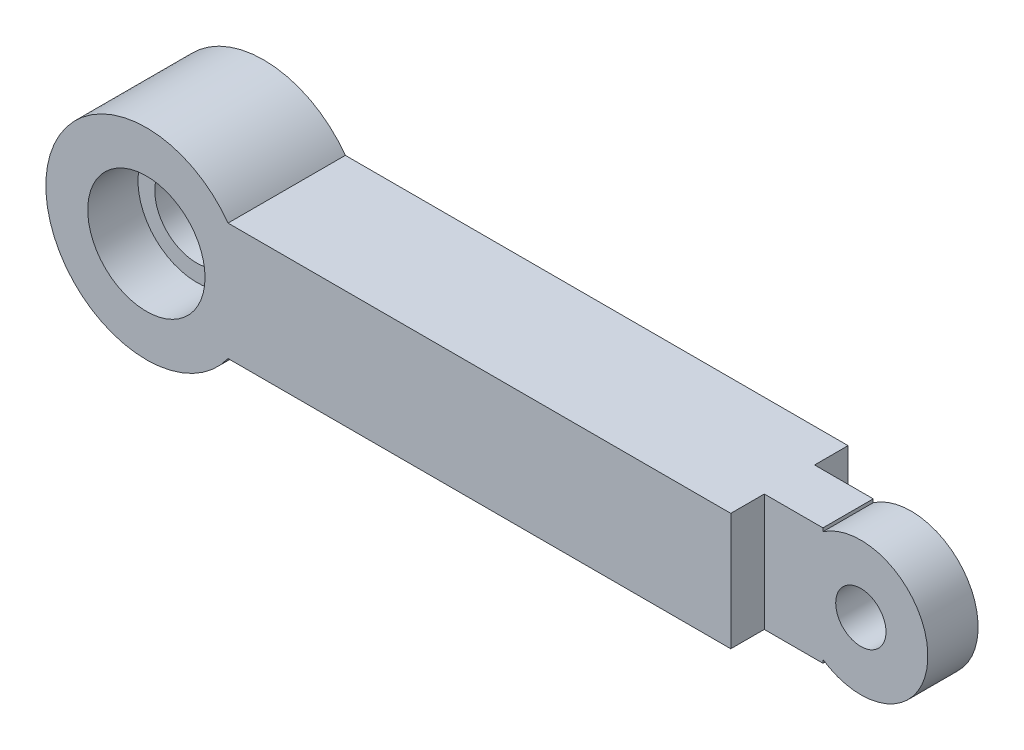
ISO-10303-21;
HEADER;
FILE_DESCRIPTION(('STEP AP214'),'2;1');
FILE_NAME('part.step','',(''),(''),'','','');
FILE_SCHEMA(('AUTOMOTIVE_DESIGN { 1 0 10303 214 1 1 1 1 }'));
ENDSEC;
DATA;
#1=APPLICATION_CONTEXT('core data for automotive mechanical design processes');
#2=APPLICATION_PROTOCOL_DEFINITION('international standard','automotive_design',2000,#1);
#3=PRODUCT_CONTEXT('',#1,'mechanical');
#4=PRODUCT('Part','Part','',(#3));
#5=PRODUCT_RELATED_PRODUCT_CATEGORY('part','',(#4));
#6=PRODUCT_DEFINITION_FORMATION('','',#4);
#7=PRODUCT_DEFINITION_CONTEXT('part definition',#1,'design');
#8=PRODUCT_DEFINITION('design','',#6,#7);
#9=PRODUCT_DEFINITION_SHAPE('','',#8);
#10=(LENGTH_UNIT() NAMED_UNIT(*) SI_UNIT(.MILLI.,.METRE.));
#11=(NAMED_UNIT(*) PLANE_ANGLE_UNIT() SI_UNIT($,.RADIAN.));
#12=(NAMED_UNIT(*) SI_UNIT($,.STERADIAN.) SOLID_ANGLE_UNIT());
#13=UNCERTAINTY_MEASURE_WITH_UNIT(LENGTH_MEASURE(1.E-05),#10,'distance_accuracy_value','');
#14=(GEOMETRIC_REPRESENTATION_CONTEXT(3) GLOBAL_UNCERTAINTY_ASSIGNED_CONTEXT((#13)) GLOBAL_UNIT_ASSIGNED_CONTEXT((#10,
#11,#12)) REPRESENTATION_CONTEXT('',''));
#15=CARTESIAN_POINT('',(0.,0.,0.));
#16=DIRECTION('',(0.,0.,1.));
#17=DIRECTION('',(1.,0.,0.));
#18=AXIS2_PLACEMENT_3D('',#15,#16,#17);
#19=CARTESIAN_POINT('',(-198.733971724045,0.,20.));
#20=DIRECTION('',(0.,0.,1.));
#21=DIRECTION('',(1.,0.,0.));
#22=AXIS2_PLACEMENT_3D('',#19,#20,#21);
#23=CYLINDRICAL_SURFACE('',#22,25.);
#24=CARTESIAN_POINT('',(-198.733971724045,0.,20.));
#25=DIRECTION('',(0.,0.,1.));
#26=DIRECTION('',(1.,0.,0.));
#27=AXIS2_PLACEMENT_3D('',#24,#25,#26);
#28=CIRCLE('',#27,25.);
#29=CARTESIAN_POINT('',(-173.733971724045,0.,20.));
#30=VERTEX_POINT('',#29);
#31=EDGE_CURVE('E198',#30,#30,#28,.T.);
#32=ORIENTED_EDGE('',*,*,#31,.F.);
#33=EDGE_LOOP('',(#32));
#34=FACE_BOUND('',#33,.T.);
#35=CARTESIAN_POINT('',(-198.733971724045,0.,40.));
#36=DIRECTION('',(0.,0.,1.));
#37=DIRECTION('',(1.,0.,0.));
#38=AXIS2_PLACEMENT_3D('',#35,#36,#37);
#39=CIRCLE('',#38,25.);
#40=CARTESIAN_POINT('',(-173.733971724045,0.,40.));
#41=VERTEX_POINT('',#40);
#42=EDGE_CURVE('E43',#41,#41,#39,.F.);
#43=ORIENTED_EDGE('',*,*,#42,.F.);
#44=EDGE_LOOP('',(#43));
#45=FACE_BOUND('',#44,.T.);
#46=ADVANCED_FACE('F39',(#34,#45),#23,.F.);
#47=CARTESIAN_POINT('',(-207.358971724045,14.9389382152816,70.));
#48=DIRECTION('',(0.,0.,-1.));
#49=DIRECTION('',(-1.,0.,0.));
#50=AXIS2_PLACEMENT_3D('',#47,#48,#49);
#51=CYLINDRICAL_SURFACE('',#50,2.);
#52=CARTESIAN_POINT('',(-207.358971724045,14.9389382152816,0.));
#53=DIRECTION('',(0.,0.,-1.));
#54=DIRECTION('',(-1.,0.,0.));
#55=AXIS2_PLACEMENT_3D('',#52,#53,#54);
#56=CIRCLE('',#55,2.);
#57=CARTESIAN_POINT('',(-209.358971724045,14.9389382152816,0.));
#58=VERTEX_POINT('',#57);
#59=EDGE_CURVE('E229',#58,#58,#56,.T.);
#60=ORIENTED_EDGE('',*,*,#59,.T.);
#61=EDGE_LOOP('',(#60));
#62=FACE_BOUND('',#61,.T.);
#63=CARTESIAN_POINT('',(-207.358971724045,14.9389382152816,20.));
#64=DIRECTION('',(0.,0.,1.));
#65=DIRECTION('',(1.,0.,0.));
#66=AXIS2_PLACEMENT_3D('',#63,#64,#65);
#67=CIRCLE('',#66,2.);
#68=CARTESIAN_POINT('',(-205.358971724045,14.9389382152816,20.));
#69=VERTEX_POINT('',#68);
#70=EDGE_CURVE('E222',#69,#69,#67,.F.);
#71=ORIENTED_EDGE('',*,*,#70,.F.);
#72=EDGE_LOOP('',(#71));
#73=FACE_BOUND('',#72,.T.);
#74=ADVANCED_FACE('F286',(#62,#73),#51,.F.);
#75=CARTESIAN_POINT('',(-190.108971724045,14.9389382152816,70.));
#76=DIRECTION('',(0.,0.,-1.));
#77=DIRECTION('',(-1.,0.,0.));
#78=AXIS2_PLACEMENT_3D('',#75,#76,#77);
#79=CYLINDRICAL_SURFACE('',#78,1.99999999999988);
#80=CARTESIAN_POINT('',(-190.108971724045,14.9389382152816,0.));
#81=DIRECTION('',(0.,0.,-1.));
#82=DIRECTION('',(-1.,0.,0.));
#83=AXIS2_PLACEMENT_3D('',#80,#81,#82);
#84=CIRCLE('',#83,1.99999999999988);
#85=CARTESIAN_POINT('',(-192.108971724045,14.9389382152816,0.));
#86=VERTEX_POINT('',#85);
#87=EDGE_CURVE('E226',#86,#86,#84,.T.);
#88=ORIENTED_EDGE('',*,*,#87,.T.);
#89=EDGE_LOOP('',(#88));
#90=FACE_BOUND('',#89,.T.);
#91=CARTESIAN_POINT('',(-190.108971724045,14.9389382152816,20.));
#92=DIRECTION('',(0.,0.,1.));
#93=DIRECTION('',(1.,0.,0.));
#94=AXIS2_PLACEMENT_3D('',#91,#92,#93);
#95=CIRCLE('',#94,1.99999999999988);
#96=CARTESIAN_POINT('',(-188.108971724045,14.9389382152816,20.));
#97=VERTEX_POINT('',#96);
#98=EDGE_CURVE('E219',#97,#97,#95,.F.);
#99=ORIENTED_EDGE('',*,*,#98,.F.);
#100=EDGE_LOOP('',(#99));
#101=FACE_BOUND('',#100,.T.);
#102=ADVANCED_FACE('F294',(#90,#101),#79,.F.);
#103=CARTESIAN_POINT('',(-181.483971724045,0.,70.));
#104=DIRECTION('',(0.,0.,-1.));
#105=DIRECTION('',(-1.,0.,0.));
#106=AXIS2_PLACEMENT_3D('',#103,#104,#105);
#107=CYLINDRICAL_SURFACE('',#106,2.);
#108=CARTESIAN_POINT('',(-181.483971724045,0.,0.));
#109=DIRECTION('',(0.,0.,-1.));
#110=DIRECTION('',(-1.,0.,0.));
#111=AXIS2_PLACEMENT_3D('',#108,#109,#110);
#112=CIRCLE('',#111,2.);
#113=CARTESIAN_POINT('',(-183.483971724045,0.,0.));
#114=VERTEX_POINT('',#113);
#115=EDGE_CURVE('E230',#114,#114,#112,.T.);
#116=ORIENTED_EDGE('',*,*,#115,.T.);
#117=EDGE_LOOP('',(#116));
#118=FACE_BOUND('',#117,.T.);
#119=CARTESIAN_POINT('',(-181.483971724045,0.,20.));
#120=DIRECTION('',(0.,0.,1.));
#121=DIRECTION('',(1.,0.,0.));
#122=AXIS2_PLACEMENT_3D('',#119,#120,#121);
#123=CIRCLE('',#122,2.);
#124=CARTESIAN_POINT('',(-179.483971724045,0.,20.));
#125=VERTEX_POINT('',#124);
#126=EDGE_CURVE('E216',#125,#125,#123,.F.);
#127=ORIENTED_EDGE('',*,*,#126,.F.);
#128=EDGE_LOOP('',(#127));
#129=FACE_BOUND('',#128,.T.);
#130=ADVANCED_FACE('F304',(#118,#129),#107,.F.);
#131=CARTESIAN_POINT('',(-190.108971724045,-14.9389382152816,70.));
#132=DIRECTION('',(0.,0.,-1.));
#133=DIRECTION('',(-1.,0.,0.));
#134=AXIS2_PLACEMENT_3D('',#131,#132,#133);
#135=CYLINDRICAL_SURFACE('',#134,2.);
#136=CARTESIAN_POINT('',(-190.108971724045,-14.9389382152816,0.));
#137=DIRECTION('',(0.,0.,-1.));
#138=DIRECTION('',(-1.,0.,0.));
#139=AXIS2_PLACEMENT_3D('',#136,#137,#138);
#140=CIRCLE('',#139,2.);
#141=CARTESIAN_POINT('',(-192.108971724045,-14.9389382152816,0.));
#142=VERTEX_POINT('',#141);
#143=EDGE_CURVE('E233',#142,#142,#140,.T.);
#144=ORIENTED_EDGE('',*,*,#143,.T.);
#145=EDGE_LOOP('',(#144));
#146=FACE_BOUND('',#145,.T.);
#147=CARTESIAN_POINT('',(-190.108971724045,-14.9389382152816,20.));
#148=DIRECTION('',(0.,0.,1.));
#149=DIRECTION('',(1.,0.,0.));
#150=AXIS2_PLACEMENT_3D('',#147,#148,#149);
#151=CIRCLE('',#150,2.);
#152=CARTESIAN_POINT('',(-188.108971724045,-14.9389382152816,20.));
#153=VERTEX_POINT('',#152);
#154=EDGE_CURVE('E202',#153,#153,#151,.F.);
#155=ORIENTED_EDGE('',*,*,#154,.F.);
#156=EDGE_LOOP('',(#155));
#157=FACE_BOUND('',#156,.T.);
#158=ADVANCED_FACE('F308',(#146,#157),#135,.F.);
#159=CARTESIAN_POINT('',(-207.358971724045,-14.9389382152816,70.));
#160=DIRECTION('',(0.,0.,-1.));
#161=DIRECTION('',(-1.,0.,0.));
#162=AXIS2_PLACEMENT_3D('',#159,#160,#161);
#163=CYLINDRICAL_SURFACE('',#162,2.);
#164=CARTESIAN_POINT('',(-207.358971724045,-14.9389382152816,0.));
#165=DIRECTION('',(0.,0.,-1.));
#166=DIRECTION('',(-1.,0.,0.));
#167=AXIS2_PLACEMENT_3D('',#164,#165,#166);
#168=CIRCLE('',#167,2.);
#169=CARTESIAN_POINT('',(-209.358971724045,-14.9389382152816,0.));
#170=VERTEX_POINT('',#169);
#171=EDGE_CURVE('E236',#170,#170,#168,.T.);
#172=ORIENTED_EDGE('',*,*,#171,.T.);
#173=EDGE_LOOP('',(#172));
#174=FACE_BOUND('',#173,.T.);
#175=CARTESIAN_POINT('',(-207.358971724045,-14.9389382152816,20.));
#176=DIRECTION('',(0.,0.,1.));
#177=DIRECTION('',(1.,0.,0.));
#178=AXIS2_PLACEMENT_3D('',#175,#176,#177);
#179=CIRCLE('',#178,2.);
#180=CARTESIAN_POINT('',(-205.358971724045,-14.9389382152816,20.));
#181=VERTEX_POINT('',#180);
#182=EDGE_CURVE('E197',#181,#181,#179,.F.);
#183=ORIENTED_EDGE('',*,*,#182,.F.);
#184=EDGE_LOOP('',(#183));
#185=FACE_BOUND('',#184,.T.);
#186=ADVANCED_FACE('F279',(#174,#185),#163,.F.);
#187=CARTESIAN_POINT('',(-215.983971724045,0.,70.));
#188=DIRECTION('',(0.,0.,-1.));
#189=DIRECTION('',(-1.,0.,0.));
#190=AXIS2_PLACEMENT_3D('',#187,#188,#189);
#191=CYLINDRICAL_SURFACE('',#190,2.);
#192=CARTESIAN_POINT('',(-215.983971724045,0.,0.));
#193=DIRECTION('',(0.,0.,-1.));
#194=DIRECTION('',(-1.,0.,0.));
#195=AXIS2_PLACEMENT_3D('',#192,#193,#194);
#196=CIRCLE('',#195,2.);
#197=CARTESIAN_POINT('',(-217.983971724045,0.,0.));
#198=VERTEX_POINT('',#197);
#199=EDGE_CURVE('E225',#198,#198,#196,.T.);
#200=ORIENTED_EDGE('',*,*,#199,.T.);
#201=EDGE_LOOP('',(#200));
#202=FACE_BOUND('',#201,.T.);
#203=CARTESIAN_POINT('',(-215.983971724045,0.,20.));
#204=DIRECTION('',(0.,0.,1.));
#205=DIRECTION('',(1.,0.,0.));
#206=AXIS2_PLACEMENT_3D('',#203,#204,#205);
#207=CIRCLE('',#206,2.);
#208=CARTESIAN_POINT('',(-213.983971724045,0.,20.));
#209=VERTEX_POINT('',#208);
#210=EDGE_CURVE('E195',#209,#209,#207,.F.);
#211=ORIENTED_EDGE('',*,*,#210,.F.);
#212=EDGE_LOOP('',(#211));
#213=FACE_BOUND('',#212,.T.);
#214=ADVANCED_FACE('F271',(#202,#213),#191,.F.);
#215=CARTESIAN_POINT('',(185.,-81.0977222864645,20.));
#216=DIRECTION('',(1.,0.,0.));
#217=DIRECTION('',(0.,0.,-1.));
#218=AXIS2_PLACEMENT_3D('',#215,#216,#217);
#219=PLANE('',#218);
#220=DIRECTION('',(0.,0.,1.));
#221=VECTOR('',#220,1.);
#222=CARTESIAN_POINT('',(185.,32.9999999999999,-93.1370849898475));
#223=LINE('',#222,#221);
#224=CARTESIAN_POINT('',(185.,33.,20.));
#225=VERTEX_POINT('',#224);
#226=CARTESIAN_POINT('',(185.,33.,50.));
#227=VERTEX_POINT('',#226);
#228=EDGE_CURVE('E134',#225,#227,#223,.T.);
#229=ORIENTED_EDGE('',*,*,#228,.F.);
#230=DIRECTION('',(0.,1.,0.));
#231=VECTOR('',#230,1.);
#232=CARTESIAN_POINT('',(185.,-81.0977222864645,20.));
#233=LINE('',#232,#231);
#234=CARTESIAN_POINT('',(185.,35.,20.));
#235=VERTEX_POINT('',#234);
#236=EDGE_CURVE('E125',#225,#235,#233,.T.);
#237=ORIENTED_EDGE('',*,*,#236,.T.);
#238=DIRECTION('',(0.,0.,-1.));
#239=VECTOR('',#238,1.);
#240=CARTESIAN_POINT('',(185.,35.,20.));
#241=LINE('',#240,#239);
#242=CARTESIAN_POINT('',(185.,35.,50.));
#243=VERTEX_POINT('',#242);
#244=EDGE_CURVE('E145',#243,#235,#241,.T.);
#245=ORIENTED_EDGE('',*,*,#244,.F.);
#246=DIRECTION('',(0.,1.,0.));
#247=VECTOR('',#246,1.);
#248=CARTESIAN_POINT('',(185.,-81.0977222864645,50.));
#249=LINE('',#248,#247);
#250=EDGE_CURVE('E56',#227,#243,#249,.T.);
#251=ORIENTED_EDGE('',*,*,#250,.F.);
#252=EDGE_LOOP('',(#229,#237,#245,#251));
#253=FACE_BOUND('',#252,.T.);
#254=ADVANCED_FACE('F268',(#253),#219,.T.);
#255=CARTESIAN_POINT('',(150.,35.,70.));
#256=DIRECTION('',(-1.,0.,0.));
#257=DIRECTION('',(0.,0.,1.));
#258=AXIS2_PLACEMENT_3D('',#255,#256,#257);
#259=PLANE('',#258);
#260=DIRECTION('',(0.,1.,0.));
#261=VECTOR('',#260,1.);
#262=CARTESIAN_POINT('',(150.,-81.0977222864645,20.));
#263=LINE('',#262,#261);
#264=CARTESIAN_POINT('',(150.,-35.,20.));
#265=VERTEX_POINT('',#264);
#266=CARTESIAN_POINT('',(150.,35.,20.));
#267=VERTEX_POINT('',#266);
#268=EDGE_CURVE('E124',#265,#267,#263,.T.);
#269=ORIENTED_EDGE('',*,*,#268,.F.);
#270=DIRECTION('',(0.,0.,-1.));
#271=VECTOR('',#270,1.);
#272=CARTESIAN_POINT('',(150.,-35.,70.));
#273=LINE('',#272,#271);
#274=CARTESIAN_POINT('',(150.,-35.,0.));
#275=VERTEX_POINT('',#274);
#276=EDGE_CURVE('E181',#265,#275,#273,.T.);
#277=ORIENTED_EDGE('',*,*,#276,.T.);
#278=DIRECTION('',(0.,1.,0.));
#279=VECTOR('',#278,1.);
#280=CARTESIAN_POINT('',(150.,35.,0.));
#281=LINE('',#280,#279);
#282=CARTESIAN_POINT('',(150.,35.,0.));
#283=VERTEX_POINT('',#282);
#284=EDGE_CURVE('E169',#275,#283,#281,.T.);
#285=ORIENTED_EDGE('',*,*,#284,.T.);
#286=DIRECTION('',(0.,0.,-1.));
#287=VECTOR('',#286,1.);
#288=CARTESIAN_POINT('',(150.,35.,70.));
#289=LINE('',#288,#287);
#290=EDGE_CURVE('E48',#267,#283,#289,.T.);
#291=ORIENTED_EDGE('',*,*,#290,.F.);
#292=EDGE_LOOP('',(#269,#277,#285,#291));
#293=FACE_BOUND('',#292,.T.);
#294=ADVANCED_FACE('F270',(#293),#259,.F.);
#295=CARTESIAN_POINT('',(150.,-35.,70.));
#296=VERTEX_POINT('',#295);
#297=CARTESIAN_POINT('',(150.,-35.,50.));
#298=VERTEX_POINT('',#297);
#299=EDGE_CURVE('E189',#296,#298,#273,.T.);
#300=ORIENTED_EDGE('',*,*,#299,.T.);
#301=DIRECTION('',(0.,1.,0.));
#302=VECTOR('',#301,1.);
#303=CARTESIAN_POINT('',(150.,-81.0977222864645,50.));
#304=LINE('',#303,#302);
#305=CARTESIAN_POINT('',(150.,35.,50.));
#306=VERTEX_POINT('',#305);
#307=EDGE_CURVE('E161',#298,#306,#304,.T.);
#308=ORIENTED_EDGE('',*,*,#307,.T.);
#309=CARTESIAN_POINT('',(150.,35.,70.));
#310=VERTEX_POINT('',#309);
#311=EDGE_CURVE('E11',#310,#306,#289,.T.);
#312=ORIENTED_EDGE('',*,*,#311,.F.);
#313=DIRECTION('',(0.,1.,0.));
#314=VECTOR('',#313,1.);
#315=CARTESIAN_POINT('',(150.,35.,70.));
#316=LINE('',#315,#314);
#317=EDGE_CURVE('E172',#296,#310,#316,.T.);
#318=ORIENTED_EDGE('',*,*,#317,.F.);
#319=EDGE_LOOP('',(#300,#308,#312,#318));
#320=FACE_BOUND('',#319,.T.);
#321=ADVANCED_FACE('F41',(#320),#259,.F.);
#322=CARTESIAN_POINT('',(-150.,35.,70.));
#323=DIRECTION('',(0.,-1.,0.));
#324=DIRECTION('',(0.,0.,-1.));
#325=AXIS2_PLACEMENT_3D('',#322,#323,#324);
#326=PLANE('',#325);
#327=DIRECTION('',(-1.,0.,0.));
#328=VECTOR('',#327,1.);
#329=CARTESIAN_POINT('',(-150.,35.,0.));
#330=LINE('',#329,#328);
#331=CARTESIAN_POINT('',(-150.,35.,0.));
#332=VERTEX_POINT('',#331);
#333=EDGE_CURVE('E184',#283,#332,#330,.T.);
#334=ORIENTED_EDGE('',*,*,#333,.T.);
#335=DIRECTION('',(0.,0.,-1.));
#336=VECTOR('',#335,1.);
#337=CARTESIAN_POINT('',(-150.,35.,70.));
#338=LINE('',#337,#336);
#339=CARTESIAN_POINT('',(-150.,35.,70.));
#340=VERTEX_POINT('',#339);
#341=EDGE_CURVE('E194',#340,#332,#338,.T.);
#342=ORIENTED_EDGE('',*,*,#341,.F.);
#343=DIRECTION('',(-1.,0.,0.));
#344=VECTOR('',#343,1.);
#345=CARTESIAN_POINT('',(-150.,35.,70.));
#346=LINE('',#345,#344);
#347=EDGE_CURVE('E175',#310,#340,#346,.T.);
#348=ORIENTED_EDGE('',*,*,#347,.F.);
#349=ORIENTED_EDGE('',*,*,#311,.T.);
#350=DIRECTION('',(1.,0.,0.));
#351=VECTOR('',#350,1.);
#352=CARTESIAN_POINT('',(185.,35.,50.));
#353=LINE('',#352,#351);
#354=EDGE_CURVE('E157',#306,#243,#353,.T.);
#355=ORIENTED_EDGE('',*,*,#354,.T.);
#356=ORIENTED_EDGE('',*,*,#244,.T.);
#357=DIRECTION('',(-1.,0.,0.));
#358=VECTOR('',#357,1.);
#359=CARTESIAN_POINT('',(185.,35.,20.));
#360=LINE('',#359,#358);
#361=EDGE_CURVE('E154',#235,#267,#360,.T.);
#362=ORIENTED_EDGE('',*,*,#361,.T.);
#363=ORIENTED_EDGE('',*,*,#290,.T.);
#364=EDGE_LOOP('',(#334,#342,#348,#349,#355,#356,#362,#363));
#365=FACE_BOUND('',#364,.T.);
#366=ADVANCED_FACE('F266',(#365),#326,.F.);
#367=CARTESIAN_POINT('',(-150.,-35.,70.));
#368=DIRECTION('',(0.,1.,0.));
#369=DIRECTION('',(0.,0.,1.));
#370=AXIS2_PLACEMENT_3D('',#367,#368,#369);
#371=PLANE('',#370);
#372=DIRECTION('',(1.,0.,0.));
#373=VECTOR('',#372,1.);
#374=CARTESIAN_POINT('',(-150.,-35.,0.));
#375=LINE('',#374,#373);
#376=CARTESIAN_POINT('',(-150.,-35.,0.));
#377=VERTEX_POINT('',#376);
#378=EDGE_CURVE('E176',#377,#275,#375,.T.);
#379=ORIENTED_EDGE('',*,*,#378,.T.);
#380=ORIENTED_EDGE('',*,*,#276,.F.);
#381=DIRECTION('',(1.,0.,0.));
#382=VECTOR('',#381,1.);
#383=CARTESIAN_POINT('',(185.,-35.,20.));
#384=LINE('',#383,#382);
#385=CARTESIAN_POINT('',(185.,-35.,20.));
#386=VERTEX_POINT('',#385);
#387=EDGE_CURVE('E151',#265,#386,#384,.T.);
#388=ORIENTED_EDGE('',*,*,#387,.T.);
#389=DIRECTION('',(0.,0.,1.));
#390=VECTOR('',#389,1.);
#391=CARTESIAN_POINT('',(185.,-35.,20.));
#392=LINE('',#391,#390);
#393=CARTESIAN_POINT('',(185.,-35.,50.));
#394=VERTEX_POINT('',#393);
#395=EDGE_CURVE('E120',#386,#394,#392,.T.);
#396=ORIENTED_EDGE('',*,*,#395,.T.);
#397=DIRECTION('',(-1.,0.,0.));
#398=VECTOR('',#397,1.);
#399=CARTESIAN_POINT('',(185.,-35.,50.));
#400=LINE('',#399,#398);
#401=EDGE_CURVE('E146',#394,#298,#400,.T.);
#402=ORIENTED_EDGE('',*,*,#401,.T.);
#403=ORIENTED_EDGE('',*,*,#299,.F.);
#404=DIRECTION('',(1.,0.,0.));
#405=VECTOR('',#404,1.);
#406=CARTESIAN_POINT('',(-150.,-35.,70.));
#407=LINE('',#406,#405);
#408=CARTESIAN_POINT('',(-150.,-35.,70.));
#409=VERTEX_POINT('',#408);
#410=EDGE_CURVE('E179',#409,#296,#407,.T.);
#411=ORIENTED_EDGE('',*,*,#410,.F.);
#412=DIRECTION('',(0.,0.,-1.));
#413=VECTOR('',#412,1.);
#414=CARTESIAN_POINT('',(-150.,-35.,70.));
#415=LINE('',#414,#413);
#416=EDGE_CURVE('E191',#409,#377,#415,.T.);
#417=ORIENTED_EDGE('',*,*,#416,.T.);
#418=EDGE_LOOP('',(#379,#380,#388,#396,#402,#403,#411,#417));
#419=FACE_BOUND('',#418,.T.);
#420=ADVANCED_FACE('F260',(#419),#371,.F.);
#421=CARTESIAN_POINT('',(0.,0.,70.));
#422=DIRECTION('',(0.,0.,1.));
#423=DIRECTION('',(1.,0.,0.));
#424=AXIS2_PLACEMENT_3D('',#421,#422,#423);
#425=PLANE('',#424);
#426=CARTESIAN_POINT('',(-198.733971724045,0.,70.));
#427=DIRECTION('',(0.,0.,1.));
#428=DIRECTION('',(1.,0.,0.));
#429=AXIS2_PLACEMENT_3D('',#426,#427,#428);
#430=CIRCLE('',#429,35.0000000000001);
#431=CARTESIAN_POINT('',(-163.733971724045,0.,70.));
#432=VERTEX_POINT('',#431);
#433=EDGE_CURVE('E211',#432,#432,#430,.T.);
#434=ORIENTED_EDGE('',*,*,#433,.F.);
#435=EDGE_LOOP('',(#434));
#436=FACE_BOUND('',#435,.T.);
#437=ORIENTED_EDGE('',*,*,#347,.T.);
#438=CARTESIAN_POINT('',(-198.733971724045,0.,70.));
#439=DIRECTION('',(0.,0.,-1.));
#440=DIRECTION('',(-1.,0.,0.));
#441=AXIS2_PLACEMENT_3D('',#438,#439,#440);
#442=CIRCLE('',#441,60.);
#443=EDGE_CURVE('E167',#409,#340,#442,.T.);
#444=ORIENTED_EDGE('',*,*,#443,.F.);
#445=ORIENTED_EDGE('',*,*,#410,.T.);
#446=ORIENTED_EDGE('',*,*,#317,.T.);
#447=EDGE_LOOP('',(#437,#444,#445,#446));
#448=FACE_BOUND('',#447,.T.);
#449=ADVANCED_FACE('F340',(#436,#448),#425,.T.);
#450=CARTESIAN_POINT('',(0.,0.,0.));
#451=DIRECTION('',(0.,0.,1.));
#452=DIRECTION('',(1.,0.,0.));
#453=AXIS2_PLACEMENT_3D('',#450,#451,#452);
#454=PLANE('',#453);
#455=ORIENTED_EDGE('',*,*,#199,.F.);
#456=EDGE_LOOP('',(#455));
#457=FACE_BOUND('',#456,.T.);
#458=ORIENTED_EDGE('',*,*,#171,.F.);
#459=EDGE_LOOP('',(#458));
#460=FACE_BOUND('',#459,.T.);
#461=ORIENTED_EDGE('',*,*,#143,.F.);
#462=EDGE_LOOP('',(#461));
#463=FACE_BOUND('',#462,.T.);
#464=ORIENTED_EDGE('',*,*,#115,.F.);
#465=EDGE_LOOP('',(#464));
#466=FACE_BOUND('',#465,.T.);
#467=ORIENTED_EDGE('',*,*,#87,.F.);
#468=EDGE_LOOP('',(#467));
#469=FACE_BOUND('',#468,.T.);
#470=ORIENTED_EDGE('',*,*,#59,.F.);
#471=EDGE_LOOP('',(#470));
#472=FACE_BOUND('',#471,.T.);
#473=ORIENTED_EDGE('',*,*,#378,.F.);
#474=CARTESIAN_POINT('',(-198.733971724045,0.,0.));
#475=DIRECTION('',(0.,0.,-1.));
#476=DIRECTION('',(-1.,0.,0.));
#477=AXIS2_PLACEMENT_3D('',#474,#475,#476);
#478=CIRCLE('',#477,60.);
#479=EDGE_CURVE('E166',#377,#332,#478,.T.);
#480=ORIENTED_EDGE('',*,*,#479,.T.);
#481=ORIENTED_EDGE('',*,*,#333,.F.);
#482=ORIENTED_EDGE('',*,*,#284,.F.);
#483=EDGE_LOOP('',(#473,#480,#481,#482));
#484=FACE_BOUND('',#483,.T.);
#485=ADVANCED_FACE('F337',(#457,#460,#463,#466,#469,#472,#484),#454,.F.);
#486=CARTESIAN_POINT('',(-198.733971724045,0.,70.));
#487=DIRECTION('',(0.,0.,-1.));
#488=DIRECTION('',(-1.,0.,0.));
#489=AXIS2_PLACEMENT_3D('',#486,#487,#488);
#490=CYLINDRICAL_SURFACE('',#489,60.);
#491=ORIENTED_EDGE('',*,*,#341,.T.);
#492=ORIENTED_EDGE('',*,*,#479,.F.);
#493=ORIENTED_EDGE('',*,*,#416,.F.);
#494=ORIENTED_EDGE('',*,*,#443,.T.);
#495=EDGE_LOOP('',(#491,#492,#493,#494));
#496=FACE_BOUND('',#495,.T.);
#497=ADVANCED_FACE('F284',(#496),#490,.T.);
#498=DIRECTION('',(0.,0.,1.));
#499=VECTOR('',#498,1.);
#500=CARTESIAN_POINT('',(185.,-32.9999999999999,-93.1370849898475));
#501=LINE('',#500,#499);
#502=CARTESIAN_POINT('',(185.,-33.,50.));
#503=VERTEX_POINT('',#502);
#504=CARTESIAN_POINT('',(185.,-33.,20.));
#505=VERTEX_POINT('',#504);
#506=EDGE_CURVE('E64',#503,#505,#501,.F.);
#507=ORIENTED_EDGE('',*,*,#506,.F.);
#508=EDGE_CURVE('E149',#394,#503,#249,.T.);
#509=ORIENTED_EDGE('',*,*,#508,.F.);
#510=ORIENTED_EDGE('',*,*,#395,.F.);
#511=EDGE_CURVE('E118',#386,#505,#233,.T.);
#512=ORIENTED_EDGE('',*,*,#511,.T.);
#513=EDGE_LOOP('',(#507,#509,#510,#512));
#514=FACE_BOUND('',#513,.T.);
#515=ADVANCED_FACE('F119',(#514),#219,.T.);
#516=CARTESIAN_POINT('',(185.,-81.0977222864645,50.));
#517=DIRECTION('',(0.,0.,1.));
#518=DIRECTION('',(1.,0.,0.));
#519=AXIS2_PLACEMENT_3D('',#516,#517,#518);
#520=PLANE('',#519);
#521=CARTESIAN_POINT('',(207.605309110915,0.,50.));
#522=DIRECTION('',(0.,0.,1.));
#523=DIRECTION('',(1.,0.,0.));
#524=AXIS2_PLACEMENT_3D('',#521,#522,#523);
#525=CIRCLE('',#524,15.);
#526=CARTESIAN_POINT('',(222.605309110915,0.,50.));
#527=VERTEX_POINT('',#526);
#528=EDGE_CURVE('E140',#527,#527,#525,.T.);
#529=ORIENTED_EDGE('',*,*,#528,.F.);
#530=EDGE_LOOP('',(#529));
#531=FACE_BOUND('',#530,.T.);
#532=ORIENTED_EDGE('',*,*,#508,.T.);
#533=CARTESIAN_POINT('',(207.605309110915,0.,50.));
#534=DIRECTION('',(0.,0.,1.));
#535=DIRECTION('',(1.,0.,0.));
#536=AXIS2_PLACEMENT_3D('',#533,#534,#535);
#537=CIRCLE('',#536,40.);
#538=EDGE_CURVE('E133',#503,#227,#537,.T.);
#539=ORIENTED_EDGE('',*,*,#538,.T.);
#540=ORIENTED_EDGE('',*,*,#250,.T.);
#541=ORIENTED_EDGE('',*,*,#354,.F.);
#542=ORIENTED_EDGE('',*,*,#307,.F.);
#543=ORIENTED_EDGE('',*,*,#401,.F.);
#544=EDGE_LOOP('',(#532,#539,#540,#541,#542,#543));
#545=FACE_BOUND('',#544,.T.);
#546=ADVANCED_FACE('F251',(#531,#545),#520,.T.);
#547=CARTESIAN_POINT('',(185.,-81.0977222864645,20.));
#548=DIRECTION('',(0.,0.,-1.));
#549=DIRECTION('',(-1.,0.,0.));
#550=AXIS2_PLACEMENT_3D('',#547,#548,#549);
#551=PLANE('',#550);
#552=CARTESIAN_POINT('',(207.605309110915,0.,20.));
#553=DIRECTION('',(0.,0.,-1.));
#554=DIRECTION('',(-1.,0.,0.));
#555=AXIS2_PLACEMENT_3D('',#552,#553,#554);
#556=CIRCLE('',#555,15.);
#557=CARTESIAN_POINT('',(192.605309110915,0.,20.));
#558=VERTEX_POINT('',#557);
#559=EDGE_CURVE('E243',#558,#558,#556,.T.);
#560=ORIENTED_EDGE('',*,*,#559,.F.);
#561=EDGE_LOOP('',(#560));
#562=FACE_BOUND('',#561,.T.);
#563=ORIENTED_EDGE('',*,*,#236,.F.);
#564=CARTESIAN_POINT('',(207.605309110915,0.,20.));
#565=DIRECTION('',(0.,0.,-1.));
#566=DIRECTION('',(-1.,0.,0.));
#567=AXIS2_PLACEMENT_3D('',#564,#565,#566);
#568=CIRCLE('',#567,40.);
#569=EDGE_CURVE('E131',#505,#225,#568,.F.);
#570=ORIENTED_EDGE('',*,*,#569,.F.);
#571=ORIENTED_EDGE('',*,*,#511,.F.);
#572=ORIENTED_EDGE('',*,*,#387,.F.);
#573=ORIENTED_EDGE('',*,*,#268,.T.);
#574=ORIENTED_EDGE('',*,*,#361,.F.);
#575=EDGE_LOOP('',(#563,#570,#571,#572,#573,#574));
#576=FACE_BOUND('',#575,.T.);
#577=ADVANCED_FACE('F137',(#562,#576),#551,.T.);
#578=CARTESIAN_POINT('',(207.605309110915,0.,-93.1370849898476));
#579=DIRECTION('',(0.,0.,1.));
#580=DIRECTION('',(1.,0.,0.));
#581=AXIS2_PLACEMENT_3D('',#578,#579,#580);
#582=CYLINDRICAL_SURFACE('',#581,40.);
#583=ORIENTED_EDGE('',*,*,#569,.T.);
#584=ORIENTED_EDGE('',*,*,#228,.T.);
#585=ORIENTED_EDGE('',*,*,#538,.F.);
#586=ORIENTED_EDGE('',*,*,#506,.T.);
#587=EDGE_LOOP('',(#583,#584,#585,#586));
#588=FACE_BOUND('',#587,.T.);
#589=ADVANCED_FACE('F130',(#588),#582,.T.);
#590=CARTESIAN_POINT('',(207.605309110915,0.,70.));
#591=DIRECTION('',(0.,0.,-1.));
#592=DIRECTION('',(-1.,0.,0.));
#593=AXIS2_PLACEMENT_3D('',#590,#591,#592);
#594=CYLINDRICAL_SURFACE('',#593,15.);
#595=ORIENTED_EDGE('',*,*,#528,.T.);
#596=EDGE_LOOP('',(#595));
#597=FACE_BOUND('',#596,.T.);
#598=ORIENTED_EDGE('',*,*,#559,.T.);
#599=EDGE_LOOP('',(#598));
#600=FACE_BOUND('',#599,.T.);
#601=ADVANCED_FACE('F248',(#597,#600),#594,.F.);
#602=CARTESIAN_POINT('',(-198.733971724045,0.,20.));
#603=DIRECTION('',(0.,0.,1.));
#604=DIRECTION('',(1.,0.,0.));
#605=AXIS2_PLACEMENT_3D('',#602,#603,#604);
#606=PLANE('',#605);
#607=ORIENTED_EDGE('',*,*,#31,.T.);
#608=EDGE_LOOP('',(#607));
#609=FACE_BOUND('',#608,.T.);
#610=ORIENTED_EDGE('',*,*,#210,.T.);
#611=EDGE_LOOP('',(#610));
#612=FACE_BOUND('',#611,.T.);
#613=ORIENTED_EDGE('',*,*,#182,.T.);
#614=EDGE_LOOP('',(#613));
#615=FACE_BOUND('',#614,.T.);
#616=ORIENTED_EDGE('',*,*,#154,.T.);
#617=EDGE_LOOP('',(#616));
#618=FACE_BOUND('',#617,.T.);
#619=ORIENTED_EDGE('',*,*,#126,.T.);
#620=EDGE_LOOP('',(#619));
#621=FACE_BOUND('',#620,.T.);
#622=ORIENTED_EDGE('',*,*,#98,.T.);
#623=EDGE_LOOP('',(#622));
#624=FACE_BOUND('',#623,.T.);
#625=ORIENTED_EDGE('',*,*,#70,.T.);
#626=EDGE_LOOP('',(#625));
#627=FACE_BOUND('',#626,.T.);
#628=ADVANCED_FACE('F300',(#609,#612,#615,#618,#621,#624,#627),#606,.T.);
#629=CARTESIAN_POINT('',(-198.733971724045,0.,40.));
#630=DIRECTION('',(0.,0.,1.));
#631=DIRECTION('',(1.,0.,0.));
#632=AXIS2_PLACEMENT_3D('',#629,#630,#631);
#633=PLANE('',#632);
#634=CARTESIAN_POINT('',(-198.733971724045,0.,40.));
#635=DIRECTION('',(0.,0.,1.));
#636=DIRECTION('',(1.,0.,0.));
#637=AXIS2_PLACEMENT_3D('',#634,#635,#636);
#638=CIRCLE('',#637,35.0000000000001);
#639=CARTESIAN_POINT('',(-163.733971724045,0.,40.));
#640=VERTEX_POINT('',#639);
#641=EDGE_CURVE('E209',#640,#640,#638,.T.);
#642=ORIENTED_EDGE('',*,*,#641,.T.);
#643=EDGE_LOOP('',(#642));
#644=FACE_BOUND('',#643,.T.);
#645=ORIENTED_EDGE('',*,*,#42,.T.);
#646=EDGE_LOOP('',(#645));
#647=FACE_BOUND('',#646,.T.);
#648=ADVANCED_FACE('F374',(#644,#647),#633,.T.);
#649=CARTESIAN_POINT('',(-198.733971724045,0.,40.));
#650=DIRECTION('',(0.,0.,1.));
#651=DIRECTION('',(1.,0.,0.));
#652=AXIS2_PLACEMENT_3D('',#649,#650,#651);
#653=CYLINDRICAL_SURFACE('',#652,35.0000000000001);
#654=ORIENTED_EDGE('',*,*,#641,.F.);
#655=EDGE_LOOP('',(#654));
#656=FACE_BOUND('',#655,.T.);
#657=ORIENTED_EDGE('',*,*,#433,.T.);
#658=EDGE_LOOP('',(#657));
#659=FACE_BOUND('',#658,.T.);
#660=ADVANCED_FACE('F390',(#656,#659),#653,.F.);
#661=CLOSED_SHELL('',(#46,#74,#102,#130,#158,#186,#214,#254,#294,#321,#366,#420,#449,#485,#497,
#515,#546,#577,#589,#601,#628,#648,#660));
#662=MANIFOLD_SOLID_BREP('B2',#661);
#663=ADVANCED_BREP_SHAPE_REPRESENTATION('',(#18,#662),#14);
#664=SHAPE_DEFINITION_REPRESENTATION(#9,#663);
ENDSEC;
END-ISO-10303-21;
